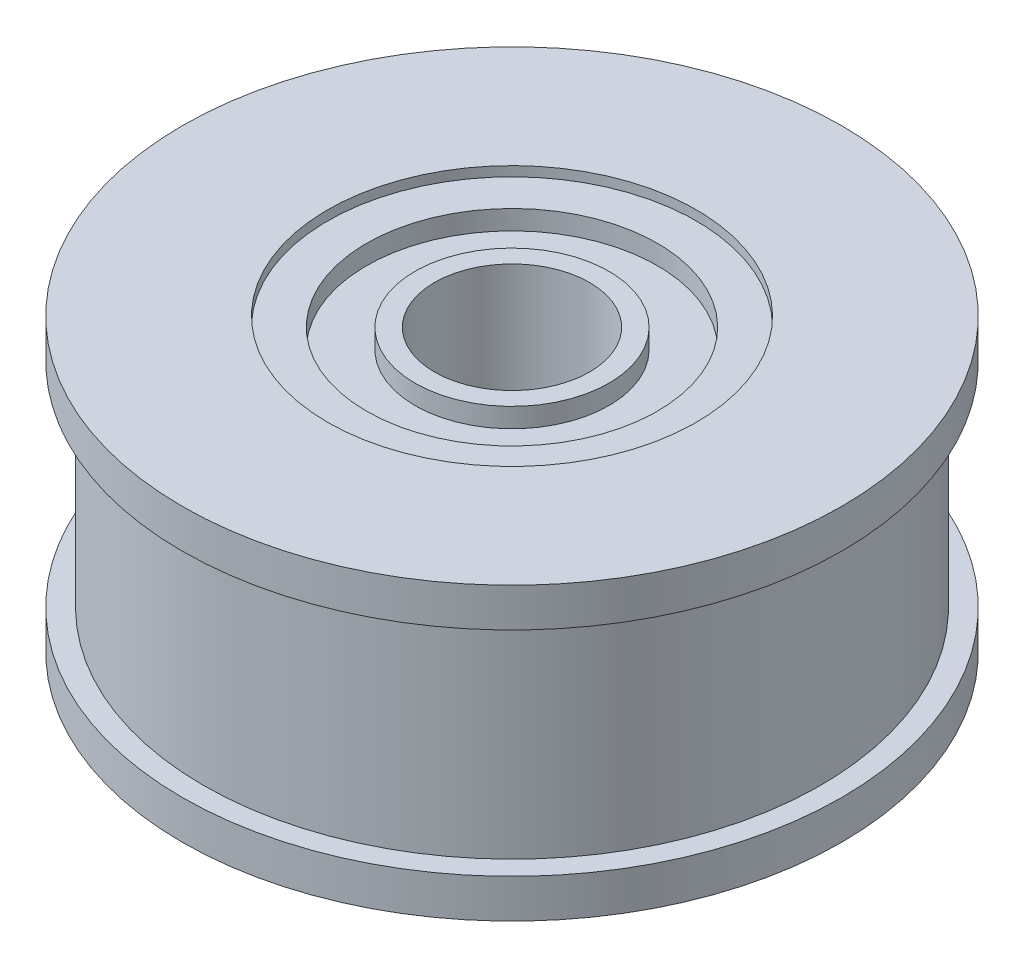
ISO-10303-21;
HEADER;
FILE_DESCRIPTION(('STEP AP214'),'2;1');
FILE_NAME('part.step','',(''),(''),'','','');
FILE_SCHEMA(('AUTOMOTIVE_DESIGN { 1 0 10303 214 1 1 1 1 }'));
ENDSEC;
DATA;
#1=APPLICATION_CONTEXT('core data for automotive mechanical design processes');
#2=APPLICATION_PROTOCOL_DEFINITION('international standard','automotive_design',2000,#1);
#3=PRODUCT_CONTEXT('',#1,'mechanical');
#4=PRODUCT('Part','Part','',(#3));
#5=PRODUCT_RELATED_PRODUCT_CATEGORY('part','',(#4));
#6=PRODUCT_DEFINITION_FORMATION('','',#4);
#7=PRODUCT_DEFINITION_CONTEXT('part definition',#1,'design');
#8=PRODUCT_DEFINITION('design','',#6,#7);
#9=PRODUCT_DEFINITION_SHAPE('','',#8);
#10=(LENGTH_UNIT() NAMED_UNIT(*) SI_UNIT(.MILLI.,.METRE.));
#11=(NAMED_UNIT(*) PLANE_ANGLE_UNIT() SI_UNIT($,.RADIAN.));
#12=(NAMED_UNIT(*) SI_UNIT($,.STERADIAN.) SOLID_ANGLE_UNIT());
#13=UNCERTAINTY_MEASURE_WITH_UNIT(LENGTH_MEASURE(1.E-05),#10,'distance_accuracy_value','');
#14=(GEOMETRIC_REPRESENTATION_CONTEXT(3) GLOBAL_UNCERTAINTY_ASSIGNED_CONTEXT((#13)) GLOBAL_UNIT_ASSIGNED_CONTEXT((#10,
#11,#12)) REPRESENTATION_CONTEXT('',''));
#15=CARTESIAN_POINT('',(0.,0.,0.));
#16=DIRECTION('',(0.,0.,1.));
#17=DIRECTION('',(1.,0.,0.));
#18=AXIS2_PLACEMENT_3D('',#15,#16,#17);
#19=CARTESIAN_POINT('',(0.,13.,0.));
#20=DIRECTION('',(0.,-1.,0.));
#21=DIRECTION('',(0.,0.,-1.));
#22=AXIS2_PLACEMENT_3D('',#19,#20,#21);
#23=CYLINDRICAL_SURFACE('',#22,4.);
#24=CARTESIAN_POINT('',(0.,-1.5,0.));
#25=DIRECTION('',(0.,-1.,0.));
#26=DIRECTION('',(0.,0.,-1.));
#27=AXIS2_PLACEMENT_3D('',#24,#25,#26);
#28=CIRCLE('',#27,4.);
#29=CARTESIAN_POINT('',(0.,-1.5,-4.));
#30=VERTEX_POINT('',#29);
#31=EDGE_CURVE('E81',#30,#30,#28,.T.);
#32=ORIENTED_EDGE('',*,*,#31,.T.);
#33=EDGE_LOOP('',(#32));
#34=FACE_BOUND('',#33,.T.);
#35=CARTESIAN_POINT('',(0.,12.5,0.));
#36=DIRECTION('',(0.,1.,0.));
#37=DIRECTION('',(0.,0.,1.));
#38=AXIS2_PLACEMENT_3D('',#35,#36,#37);
#39=CIRCLE('',#38,4.);
#40=CARTESIAN_POINT('',(0.,12.5,4.));
#41=VERTEX_POINT('',#40);
#42=EDGE_CURVE('E102',#41,#41,#39,.F.);
#43=ORIENTED_EDGE('',*,*,#42,.F.);
#44=EDGE_LOOP('',(#43));
#45=FACE_BOUND('',#44,.T.);
#46=ADVANCED_FACE('F40',(#34,#45),#23,.F.);
#47=CARTESIAN_POINT('',(0.,11.5,0.));
#48=DIRECTION('',(0.,1.,0.));
#49=DIRECTION('',(0.,0.,1.));
#50=AXIS2_PLACEMENT_3D('',#47,#48,#49);
#51=CYLINDRICAL_SURFACE('',#50,5.);
#52=CARTESIAN_POINT('',(0.,11.5,0.));
#53=DIRECTION('',(0.,1.,0.));
#54=DIRECTION('',(0.,0.,1.));
#55=AXIS2_PLACEMENT_3D('',#52,#53,#54);
#56=CIRCLE('',#55,5.);
#57=CARTESIAN_POINT('',(0.,11.5,5.));
#58=VERTEX_POINT('',#57);
#59=EDGE_CURVE('E96',#58,#58,#56,.T.);
#60=ORIENTED_EDGE('',*,*,#59,.T.);
#61=EDGE_LOOP('',(#60));
#62=FACE_BOUND('',#61,.T.);
#63=CARTESIAN_POINT('',(0.,12.5,0.));
#64=DIRECTION('',(0.,1.,0.));
#65=DIRECTION('',(0.,0.,1.));
#66=AXIS2_PLACEMENT_3D('',#63,#64,#65);
#67=CIRCLE('',#66,5.);
#68=CARTESIAN_POINT('',(0.,12.5,5.));
#69=VERTEX_POINT('',#68);
#70=EDGE_CURVE('E99',#69,#69,#67,.T.);
#71=ORIENTED_EDGE('',*,*,#70,.F.);
#72=EDGE_LOOP('',(#71));
#73=FACE_BOUND('',#72,.T.);
#74=ADVANCED_FACE('F110',(#62,#73),#51,.T.);
#75=CARTESIAN_POINT('',(0.,-0.5,0.));
#76=DIRECTION('',(0.,-1.,0.));
#77=DIRECTION('',(0.,0.,-1.));
#78=AXIS2_PLACEMENT_3D('',#75,#76,#77);
#79=CYLINDRICAL_SURFACE('',#78,5.);
#80=CARTESIAN_POINT('',(0.,-0.5,0.));
#81=DIRECTION('',(0.,-1.,0.));
#82=DIRECTION('',(0.,0.,-1.));
#83=AXIS2_PLACEMENT_3D('',#80,#81,#82);
#84=CIRCLE('',#83,5.);
#85=CARTESIAN_POINT('',(0.,-0.5,-5.));
#86=VERTEX_POINT('',#85);
#87=EDGE_CURVE('E75',#86,#86,#84,.T.);
#88=ORIENTED_EDGE('',*,*,#87,.T.);
#89=EDGE_LOOP('',(#88));
#90=FACE_BOUND('',#89,.T.);
#91=CARTESIAN_POINT('',(0.,-1.5,0.));
#92=DIRECTION('',(0.,-1.,0.));
#93=DIRECTION('',(0.,0.,-1.));
#94=AXIS2_PLACEMENT_3D('',#91,#92,#93);
#95=CIRCLE('',#94,5.);
#96=CARTESIAN_POINT('',(0.,-1.5,-5.));
#97=VERTEX_POINT('',#96);
#98=EDGE_CURVE('E78',#97,#97,#95,.T.);
#99=ORIENTED_EDGE('',*,*,#98,.F.);
#100=EDGE_LOOP('',(#99));
#101=FACE_BOUND('',#100,.T.);
#102=ADVANCED_FACE('F116',(#90,#101),#79,.T.);
#103=CARTESIAN_POINT('',(0.,11.,0.));
#104=DIRECTION('',(0.,-1.,0.));
#105=DIRECTION('',(0.,0.,-1.));
#106=AXIS2_PLACEMENT_3D('',#103,#104,#105);
#107=CYLINDRICAL_SURFACE('',#106,15.915);
#108=CARTESIAN_POINT('',(0.,11.,0.));
#109=DIRECTION('',(0.,1.,0.));
#110=DIRECTION('',(0.,0.,1.));
#111=AXIS2_PLACEMENT_3D('',#108,#109,#110);
#112=CIRCLE('',#111,15.915);
#113=CARTESIAN_POINT('',(0.,11.,15.915));
#114=VERTEX_POINT('',#113);
#115=EDGE_CURVE('E11',#114,#114,#112,.T.);
#116=ORIENTED_EDGE('',*,*,#115,.F.);
#117=EDGE_LOOP('',(#116));
#118=FACE_BOUND('',#117,.T.);
#119=CARTESIAN_POINT('',(0.,0.,0.));
#120=DIRECTION('',(0.,1.,0.));
#121=DIRECTION('',(0.,0.,1.));
#122=AXIS2_PLACEMENT_3D('',#119,#120,#121);
#123=CIRCLE('',#122,15.915);
#124=CARTESIAN_POINT('',(0.,0.,15.915));
#125=VERTEX_POINT('',#124);
#126=EDGE_CURVE('E44',#125,#125,#123,.T.);
#127=ORIENTED_EDGE('',*,*,#126,.T.);
#128=EDGE_LOOP('',(#127));
#129=FACE_BOUND('',#128,.T.);
#130=ADVANCED_FACE('F42',(#118,#129),#107,.T.);
#131=CARTESIAN_POINT('',(0.,13.,0.));
#132=DIRECTION('',(0.,-1.,0.));
#133=DIRECTION('',(0.,0.,-1.));
#134=AXIS2_PLACEMENT_3D('',#131,#132,#133);
#135=CYLINDRICAL_SURFACE('',#134,17.);
#136=CARTESIAN_POINT('',(0.,13.,0.));
#137=DIRECTION('',(0.,1.,0.));
#138=DIRECTION('',(0.,0.,1.));
#139=AXIS2_PLACEMENT_3D('',#136,#137,#138);
#140=CIRCLE('',#139,17.);
#141=CARTESIAN_POINT('',(0.,13.,17.));
#142=VERTEX_POINT('',#141);
#143=EDGE_CURVE('E48',#142,#142,#140,.T.);
#144=ORIENTED_EDGE('',*,*,#143,.F.);
#145=EDGE_LOOP('',(#144));
#146=FACE_BOUND('',#145,.T.);
#147=CARTESIAN_POINT('',(0.,11.,0.));
#148=DIRECTION('',(0.,1.,0.));
#149=DIRECTION('',(0.,0.,1.));
#150=AXIS2_PLACEMENT_3D('',#147,#148,#149);
#151=CIRCLE('',#150,17.);
#152=CARTESIAN_POINT('',(0.,11.,17.));
#153=VERTEX_POINT('',#152);
#154=EDGE_CURVE('E52',#153,#153,#151,.T.);
#155=ORIENTED_EDGE('',*,*,#154,.T.);
#156=EDGE_LOOP('',(#155));
#157=FACE_BOUND('',#156,.T.);
#158=ADVANCED_FACE('F162',(#146,#157),#135,.T.);
#159=CARTESIAN_POINT('',(0.,13.,0.));
#160=DIRECTION('',(0.,1.,0.));
#161=DIRECTION('',(0.,0.,1.));
#162=AXIS2_PLACEMENT_3D('',#159,#160,#161);
#163=PLANE('',#162);
#164=CARTESIAN_POINT('',(0.,13.,0.));
#165=DIRECTION('',(0.,1.,0.));
#166=DIRECTION('',(0.,0.,1.));
#167=AXIS2_PLACEMENT_3D('',#164,#165,#166);
#168=CIRCLE('',#167,9.5);
#169=CARTESIAN_POINT('',(0.,13.,9.5));
#170=VERTEX_POINT('',#169);
#171=EDGE_CURVE('E85',#170,#170,#168,.T.);
#172=ORIENTED_EDGE('',*,*,#171,.F.);
#173=EDGE_LOOP('',(#172));
#174=FACE_BOUND('',#173,.T.);
#175=ORIENTED_EDGE('',*,*,#143,.T.);
#176=EDGE_LOOP('',(#175));
#177=FACE_BOUND('',#176,.T.);
#178=ADVANCED_FACE('F159',(#174,#177),#163,.T.);
#179=CARTESIAN_POINT('',(0.,11.,0.));
#180=DIRECTION('',(0.,1.,0.));
#181=DIRECTION('',(0.,0.,1.));
#182=AXIS2_PLACEMENT_3D('',#179,#180,#181);
#183=PLANE('',#182);
#184=ORIENTED_EDGE('',*,*,#115,.T.);
#185=EDGE_LOOP('',(#184));
#186=FACE_BOUND('',#185,.T.);
#187=ORIENTED_EDGE('',*,*,#154,.F.);
#188=EDGE_LOOP('',(#187));
#189=FACE_BOUND('',#188,.T.);
#190=ADVANCED_FACE('F157',(#186,#189),#183,.F.);
#191=CARTESIAN_POINT('',(0.,-2.,0.));
#192=DIRECTION('',(0.,1.,0.));
#193=DIRECTION('',(0.,0.,1.));
#194=AXIS2_PLACEMENT_3D('',#191,#192,#193);
#195=CYLINDRICAL_SURFACE('',#194,17.);
#196=CARTESIAN_POINT('',(0.,-2.,0.));
#197=DIRECTION('',(0.,-1.,0.));
#198=DIRECTION('',(0.,0.,-1.));
#199=AXIS2_PLACEMENT_3D('',#196,#197,#198);
#200=CIRCLE('',#199,17.);
#201=CARTESIAN_POINT('',(0.,-2.,-17.));
#202=VERTEX_POINT('',#201);
#203=EDGE_CURVE('E60',#202,#202,#200,.T.);
#204=ORIENTED_EDGE('',*,*,#203,.F.);
#205=EDGE_LOOP('',(#204));
#206=FACE_BOUND('',#205,.T.);
#207=CARTESIAN_POINT('',(0.,0.,0.));
#208=DIRECTION('',(0.,-1.,0.));
#209=DIRECTION('',(0.,0.,-1.));
#210=AXIS2_PLACEMENT_3D('',#207,#208,#209);
#211=CIRCLE('',#210,17.);
#212=CARTESIAN_POINT('',(0.,0.,-17.));
#213=VERTEX_POINT('',#212);
#214=EDGE_CURVE('E57',#213,#213,#211,.T.);
#215=ORIENTED_EDGE('',*,*,#214,.T.);
#216=EDGE_LOOP('',(#215));
#217=FACE_BOUND('',#216,.T.);
#218=ADVANCED_FACE('F150',(#206,#217),#195,.T.);
#219=CARTESIAN_POINT('',(0.,-2.,0.));
#220=DIRECTION('',(0.,-1.,0.));
#221=DIRECTION('',(0.,0.,-1.));
#222=AXIS2_PLACEMENT_3D('',#219,#220,#221);
#223=PLANE('',#222);
#224=CARTESIAN_POINT('',(0.,-2.,0.));
#225=DIRECTION('',(0.,-1.,0.));
#226=DIRECTION('',(0.,0.,-1.));
#227=AXIS2_PLACEMENT_3D('',#224,#225,#226);
#228=CIRCLE('',#227,9.5);
#229=CARTESIAN_POINT('',(0.,-2.,-9.5));
#230=VERTEX_POINT('',#229);
#231=EDGE_CURVE('E64',#230,#230,#228,.T.);
#232=ORIENTED_EDGE('',*,*,#231,.F.);
#233=EDGE_LOOP('',(#232));
#234=FACE_BOUND('',#233,.T.);
#235=ORIENTED_EDGE('',*,*,#203,.T.);
#236=EDGE_LOOP('',(#235));
#237=FACE_BOUND('',#236,.T.);
#238=ADVANCED_FACE('F147',(#234,#237),#223,.T.);
#239=CARTESIAN_POINT('',(0.,0.,0.));
#240=DIRECTION('',(0.,-1.,0.));
#241=DIRECTION('',(0.,0.,-1.));
#242=AXIS2_PLACEMENT_3D('',#239,#240,#241);
#243=PLANE('',#242);
#244=ORIENTED_EDGE('',*,*,#126,.F.);
#245=EDGE_LOOP('',(#244));
#246=FACE_BOUND('',#245,.T.);
#247=ORIENTED_EDGE('',*,*,#214,.F.);
#248=EDGE_LOOP('',(#247));
#249=FACE_BOUND('',#248,.T.);
#250=ADVANCED_FACE('F145',(#246,#249),#243,.F.);
#251=CARTESIAN_POINT('',(0.,-1.5,0.));
#252=DIRECTION('',(0.,-1.,0.));
#253=DIRECTION('',(0.,0.,-1.));
#254=AXIS2_PLACEMENT_3D('',#251,#252,#253);
#255=CYLINDRICAL_SURFACE('',#254,9.5);
#256=CARTESIAN_POINT('',(0.,-1.5,0.));
#257=DIRECTION('',(0.,-1.,0.));
#258=DIRECTION('',(0.,0.,-1.));
#259=AXIS2_PLACEMENT_3D('',#256,#257,#258);
#260=CIRCLE('',#259,9.5);
#261=CARTESIAN_POINT('',(0.,-1.5,-9.5));
#262=VERTEX_POINT('',#261);
#263=EDGE_CURVE('E61',#262,#262,#260,.T.);
#264=ORIENTED_EDGE('',*,*,#263,.F.);
#265=EDGE_LOOP('',(#264));
#266=FACE_BOUND('',#265,.T.);
#267=ORIENTED_EDGE('',*,*,#231,.T.);
#268=EDGE_LOOP('',(#267));
#269=FACE_BOUND('',#268,.T.);
#270=ADVANCED_FACE('F141',(#266,#269),#255,.F.);
#271=CARTESIAN_POINT('',(0.,-1.5,0.));
#272=DIRECTION('',(0.,-1.,0.));
#273=DIRECTION('',(0.,0.,-1.));
#274=AXIS2_PLACEMENT_3D('',#271,#272,#273);
#275=PLANE('',#274);
#276=CARTESIAN_POINT('',(0.,-1.5,0.));
#277=DIRECTION('',(0.,-1.,0.));
#278=DIRECTION('',(0.,0.,-1.));
#279=AXIS2_PLACEMENT_3D('',#276,#277,#278);
#280=CIRCLE('',#279,7.5);
#281=CARTESIAN_POINT('',(0.,-1.5,-7.5));
#282=VERTEX_POINT('',#281);
#283=EDGE_CURVE('E67',#282,#282,#280,.T.);
#284=ORIENTED_EDGE('',*,*,#283,.F.);
#285=EDGE_LOOP('',(#284));
#286=FACE_BOUND('',#285,.T.);
#287=ORIENTED_EDGE('',*,*,#263,.T.);
#288=EDGE_LOOP('',(#287));
#289=FACE_BOUND('',#288,.T.);
#290=ADVANCED_FACE('F134',(#286,#289),#275,.T.);
#291=CARTESIAN_POINT('',(0.,-0.5,0.));
#292=DIRECTION('',(0.,-1.,0.));
#293=DIRECTION('',(0.,0.,-1.));
#294=AXIS2_PLACEMENT_3D('',#291,#292,#293);
#295=CYLINDRICAL_SURFACE('',#294,7.5);
#296=ORIENTED_EDGE('',*,*,#283,.T.);
#297=EDGE_LOOP('',(#296));
#298=FACE_BOUND('',#297,.T.);
#299=CARTESIAN_POINT('',(0.,-0.5,0.));
#300=DIRECTION('',(0.,-1.,0.));
#301=DIRECTION('',(0.,0.,-1.));
#302=AXIS2_PLACEMENT_3D('',#299,#300,#301);
#303=CIRCLE('',#302,7.5);
#304=CARTESIAN_POINT('',(0.,-0.5,-7.5));
#305=VERTEX_POINT('',#304);
#306=EDGE_CURVE('E72',#305,#305,#303,.T.);
#307=ORIENTED_EDGE('',*,*,#306,.F.);
#308=EDGE_LOOP('',(#307));
#309=FACE_BOUND('',#308,.T.);
#310=ADVANCED_FACE('F130',(#298,#309),#295,.F.);
#311=CARTESIAN_POINT('',(0.,-0.5,0.));
#312=DIRECTION('',(0.,-1.,0.));
#313=DIRECTION('',(0.,0.,-1.));
#314=AXIS2_PLACEMENT_3D('',#311,#312,#313);
#315=PLANE('',#314);
#316=ORIENTED_EDGE('',*,*,#87,.F.);
#317=EDGE_LOOP('',(#316));
#318=FACE_BOUND('',#317,.T.);
#319=ORIENTED_EDGE('',*,*,#306,.T.);
#320=EDGE_LOOP('',(#319));
#321=FACE_BOUND('',#320,.T.);
#322=ADVANCED_FACE('F126',(#318,#321),#315,.T.);
#323=CARTESIAN_POINT('',(0.,-1.5,0.));
#324=DIRECTION('',(0.,-1.,0.));
#325=DIRECTION('',(0.,0.,-1.));
#326=AXIS2_PLACEMENT_3D('',#323,#324,#325);
#327=PLANE('',#326);
#328=ORIENTED_EDGE('',*,*,#31,.F.);
#329=EDGE_LOOP('',(#328));
#330=FACE_BOUND('',#329,.T.);
#331=ORIENTED_EDGE('',*,*,#98,.T.);
#332=EDGE_LOOP('',(#331));
#333=FACE_BOUND('',#332,.T.);
#334=ADVANCED_FACE('F123',(#330,#333),#327,.T.);
#335=CARTESIAN_POINT('',(0.,12.5,0.));
#336=DIRECTION('',(0.,1.,0.));
#337=DIRECTION('',(0.,0.,1.));
#338=AXIS2_PLACEMENT_3D('',#335,#336,#337);
#339=CYLINDRICAL_SURFACE('',#338,9.5);
#340=CARTESIAN_POINT('',(0.,12.5,0.));
#341=DIRECTION('',(0.,1.,0.));
#342=DIRECTION('',(0.,0.,1.));
#343=AXIS2_PLACEMENT_3D('',#340,#341,#342);
#344=CIRCLE('',#343,9.5);
#345=CARTESIAN_POINT('',(0.,12.5,9.5));
#346=VERTEX_POINT('',#345);
#347=EDGE_CURVE('E84',#346,#346,#344,.T.);
#348=ORIENTED_EDGE('',*,*,#347,.F.);
#349=EDGE_LOOP('',(#348));
#350=FACE_BOUND('',#349,.T.);
#351=ORIENTED_EDGE('',*,*,#171,.T.);
#352=EDGE_LOOP('',(#351));
#353=FACE_BOUND('',#352,.T.);
#354=ADVANCED_FACE('F121',(#350,#353),#339,.F.);
#355=CARTESIAN_POINT('',(0.,12.5,0.));
#356=DIRECTION('',(0.,1.,0.));
#357=DIRECTION('',(0.,0.,1.));
#358=AXIS2_PLACEMENT_3D('',#355,#356,#357);
#359=PLANE('',#358);
#360=CARTESIAN_POINT('',(0.,12.5,0.));
#361=DIRECTION('',(0.,1.,0.));
#362=DIRECTION('',(0.,0.,1.));
#363=AXIS2_PLACEMENT_3D('',#360,#361,#362);
#364=CIRCLE('',#363,7.5);
#365=CARTESIAN_POINT('',(0.,12.5,7.5));
#366=VERTEX_POINT('',#365);
#367=EDGE_CURVE('E88',#366,#366,#364,.T.);
#368=ORIENTED_EDGE('',*,*,#367,.F.);
#369=EDGE_LOOP('',(#368));
#370=FACE_BOUND('',#369,.T.);
#371=ORIENTED_EDGE('',*,*,#347,.T.);
#372=EDGE_LOOP('',(#371));
#373=FACE_BOUND('',#372,.T.);
#374=ADVANCED_FACE('F223',(#370,#373),#359,.T.);
#375=CARTESIAN_POINT('',(0.,11.5,0.));
#376=DIRECTION('',(0.,1.,0.));
#377=DIRECTION('',(0.,0.,1.));
#378=AXIS2_PLACEMENT_3D('',#375,#376,#377);
#379=CYLINDRICAL_SURFACE('',#378,7.5);
#380=ORIENTED_EDGE('',*,*,#367,.T.);
#381=EDGE_LOOP('',(#380));
#382=FACE_BOUND('',#381,.T.);
#383=CARTESIAN_POINT('',(0.,11.5,0.));
#384=DIRECTION('',(0.,1.,0.));
#385=DIRECTION('',(0.,0.,1.));
#386=AXIS2_PLACEMENT_3D('',#383,#384,#385);
#387=CIRCLE('',#386,7.5);
#388=CARTESIAN_POINT('',(0.,11.5,7.5));
#389=VERTEX_POINT('',#388);
#390=EDGE_CURVE('E93',#389,#389,#387,.T.);
#391=ORIENTED_EDGE('',*,*,#390,.F.);
#392=EDGE_LOOP('',(#391));
#393=FACE_BOUND('',#392,.T.);
#394=ADVANCED_FACE('F215',(#382,#393),#379,.F.);
#395=CARTESIAN_POINT('',(0.,11.5,0.));
#396=DIRECTION('',(0.,1.,0.));
#397=DIRECTION('',(0.,0.,1.));
#398=AXIS2_PLACEMENT_3D('',#395,#396,#397);
#399=PLANE('',#398);
#400=ORIENTED_EDGE('',*,*,#59,.F.);
#401=EDGE_LOOP('',(#400));
#402=FACE_BOUND('',#401,.T.);
#403=ORIENTED_EDGE('',*,*,#390,.T.);
#404=EDGE_LOOP('',(#403));
#405=FACE_BOUND('',#404,.T.);
#406=ADVANCED_FACE('F206',(#402,#405),#399,.T.);
#407=CARTESIAN_POINT('',(0.,12.5,0.));
#408=DIRECTION('',(0.,1.,0.));
#409=DIRECTION('',(0.,0.,1.));
#410=AXIS2_PLACEMENT_3D('',#407,#408,#409);
#411=PLANE('',#410);
#412=ORIENTED_EDGE('',*,*,#42,.T.);
#413=EDGE_LOOP('',(#412));
#414=FACE_BOUND('',#413,.T.);
#415=ORIENTED_EDGE('',*,*,#70,.T.);
#416=EDGE_LOOP('',(#415));
#417=FACE_BOUND('',#416,.T.);
#418=ADVANCED_FACE('F106',(#414,#417),#411,.T.);
#419=CLOSED_SHELL('',(#46,#74,#102,#130,#158,#178,#190,#218,#238,#250,#270,#290,#310,#322,#334,
#354,#374,#394,#406,#418));
#420=MANIFOLD_SOLID_BREP('B2',#419);
#421=ADVANCED_BREP_SHAPE_REPRESENTATION('',(#18,#420),#14);
#422=SHAPE_DEFINITION_REPRESENTATION(#9,#421);
ENDSEC;
END-ISO-10303-21;
